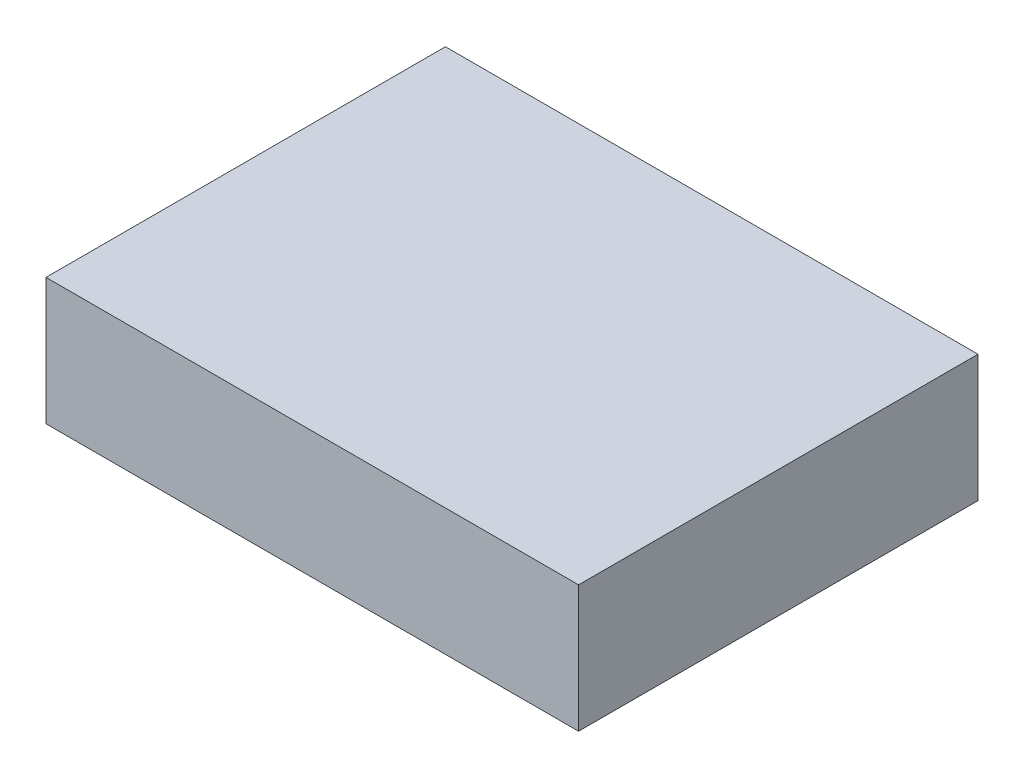
ISO-10303-21;
HEADER;
FILE_DESCRIPTION(('STEP AP214'),'2;1');
FILE_NAME('part.step','',(''),(''),'','','');
FILE_SCHEMA(('AUTOMOTIVE_DESIGN { 1 0 10303 214 1 1 1 1 }'));
ENDSEC;
DATA;
#1=APPLICATION_CONTEXT('core data for automotive mechanical design processes');
#2=APPLICATION_PROTOCOL_DEFINITION('international standard','automotive_design',2000,#1);
#3=PRODUCT_CONTEXT('',#1,'mechanical');
#4=PRODUCT('Part','Part','',(#3));
#5=PRODUCT_RELATED_PRODUCT_CATEGORY('part','',(#4));
#6=PRODUCT_DEFINITION_FORMATION('','',#4);
#7=PRODUCT_DEFINITION_CONTEXT('part definition',#1,'design');
#8=PRODUCT_DEFINITION('design','',#6,#7);
#9=PRODUCT_DEFINITION_SHAPE('','',#8);
#10=(LENGTH_UNIT() NAMED_UNIT(*) SI_UNIT(.MILLI.,.METRE.));
#11=(NAMED_UNIT(*) PLANE_ANGLE_UNIT() SI_UNIT($,.RADIAN.));
#12=(NAMED_UNIT(*) SI_UNIT($,.STERADIAN.) SOLID_ANGLE_UNIT());
#13=UNCERTAINTY_MEASURE_WITH_UNIT(LENGTH_MEASURE(1.E-05),#10,'distance_accuracy_value','');
#14=(GEOMETRIC_REPRESENTATION_CONTEXT(3) GLOBAL_UNCERTAINTY_ASSIGNED_CONTEXT((#13)) GLOBAL_UNIT_ASSIGNED_CONTEXT((#10,
#11,#12)) REPRESENTATION_CONTEXT('',''));
#15=CARTESIAN_POINT('',(0.,0.,0.));
#16=DIRECTION('',(0.,0.,1.));
#17=DIRECTION('',(1.,0.,0.));
#18=AXIS2_PLACEMENT_3D('',#15,#16,#17);
#19=CARTESIAN_POINT('',(0.,10.,0.));
#20=DIRECTION('',(0.,1.,0.));
#21=DIRECTION('',(0.,0.,1.));
#22=AXIS2_PLACEMENT_3D('',#19,#20,#21);
#23=PLANE('',#22);
#24=CARTESIAN_POINT('',(168.20925566672,10.,-172.938422578134));
#25=DIRECTION('',(0.,1.,0.));
#26=DIRECTION('',(0.,0.,1.));
#27=AXIS2_PLACEMENT_3D('',#24,#25,#26);
#28=CIRCLE('',#27,3.95154024550823);
#29=CARTESIAN_POINT('',(168.20925566672,10.,-168.986882332626));
#30=VERTEX_POINT('',#29);
#31=EDGE_CURVE('E252',#30,#30,#28,.T.);
#32=ORIENTED_EDGE('',*,*,#31,.F.);
#33=EDGE_LOOP('',(#32));
#34=FACE_BOUND('',#33,.T.);
#35=DIRECTION('',(-1.,0.,0.));
#36=VECTOR('',#35,1.);
#37=CARTESIAN_POINT('',(0.,10.,-157.5));
#38=LINE('',#37,#36);
#39=CARTESIAN_POINT('',(181.491132728051,10.,-157.5));
#40=VERTEX_POINT('',#39);
#41=CARTESIAN_POINT('',(156.491132728051,10.,-157.5));
#42=VERTEX_POINT('',#41);
#43=EDGE_CURVE('E11',#40,#42,#38,.T.);
#44=ORIENTED_EDGE('',*,*,#43,.F.);
#45=DIRECTION('',(0.,0.,-1.));
#46=VECTOR('',#45,1.);
#47=CARTESIAN_POINT('',(181.491132728051,10.,0.));
#48=LINE('',#47,#46);
#49=CARTESIAN_POINT('',(181.491132728051,10.,-172.5));
#50=VERTEX_POINT('',#49);
#51=EDGE_CURVE('E126',#40,#50,#48,.T.);
#52=ORIENTED_EDGE('',*,*,#51,.T.);
#53=CARTESIAN_POINT('',(171.491132728051,10.,-172.5));
#54=DIRECTION('',(0.,1.,0.));
#55=DIRECTION('',(0.,0.,1.));
#56=AXIS2_PLACEMENT_3D('',#53,#54,#55);
#57=CIRCLE('',#56,10.);
#58=CARTESIAN_POINT('',(171.49113272805,10.,-182.5));
#59=VERTEX_POINT('',#58);
#60=EDGE_CURVE('E270',#59,#50,#57,.F.);
#61=ORIENTED_EDGE('',*,*,#60,.F.);
#62=DIRECTION('',(1.,0.,0.));
#63=VECTOR('',#62,1.);
#64=CARTESIAN_POINT('',(0.,10.,-182.5));
#65=LINE('',#64,#63);
#66=CARTESIAN_POINT('',(166.491132728051,10.,-182.5));
#67=VERTEX_POINT('',#66);
#68=EDGE_CURVE('E273',#67,#59,#65,.T.);
#69=ORIENTED_EDGE('',*,*,#68,.F.);
#70=CARTESIAN_POINT('',(166.491132728051,10.,-172.5));
#71=DIRECTION('',(0.,1.,0.));
#72=DIRECTION('',(0.,0.,1.));
#73=AXIS2_PLACEMENT_3D('',#70,#71,#72);
#74=CIRCLE('',#73,10.);
#75=CARTESIAN_POINT('',(156.491132728051,10.,-172.5));
#76=VERTEX_POINT('',#75);
#77=EDGE_CURVE('E276',#76,#67,#74,.F.);
#78=ORIENTED_EDGE('',*,*,#77,.F.);
#79=DIRECTION('',(0.,0.,-1.));
#80=VECTOR('',#79,1.);
#81=CARTESIAN_POINT('',(156.491132728051,10.,0.));
#82=LINE('',#81,#80);
#83=EDGE_CURVE('E279',#42,#76,#82,.T.);
#84=ORIENTED_EDGE('',*,*,#83,.F.);
#85=EDGE_LOOP('',(#44,#52,#61,#69,#78,#84));
#86=FACE_BOUND('',#85,.T.);
#87=ADVANCED_FACE('F37',(#34,#86),#23,.T.);
#88=CARTESIAN_POINT('',(0.,10.,0.));
#89=DIRECTION('',(0.,0.,-1.));
#90=DIRECTION('',(-1.,0.,0.));
#91=AXIS2_PLACEMENT_3D('',#88,#89,#90);
#92=PLANE('',#91);
#93=DIRECTION('',(1.,0.,0.));
#94=VECTOR('',#93,1.);
#95=CARTESIAN_POINT('',(0.,0.,0.));
#96=LINE('',#95,#94);
#97=CARTESIAN_POINT('',(0.,0.,0.));
#98=VERTEX_POINT('',#97);
#99=CARTESIAN_POINT('',(210.,0.,0.));
#100=VERTEX_POINT('',#99);
#101=EDGE_CURVE('E177',#98,#100,#96,.T.);
#102=ORIENTED_EDGE('',*,*,#101,.T.);
#103=DIRECTION('',(0.,-1.,0.));
#104=VECTOR('',#103,1.);
#105=CARTESIAN_POINT('',(210.,10.,0.));
#106=LINE('',#105,#104);
#107=CARTESIAN_POINT('',(210.,50.,0.));
#108=VERTEX_POINT('',#107);
#109=EDGE_CURVE('E242',#108,#100,#106,.T.);
#110=ORIENTED_EDGE('',*,*,#109,.F.);
#111=DIRECTION('',(1.,0.,0.));
#112=VECTOR('',#111,1.);
#113=CARTESIAN_POINT('',(0.,50.,0.));
#114=LINE('',#113,#112);
#115=CARTESIAN_POINT('',(0.,50.,0.));
#116=VERTEX_POINT('',#115);
#117=EDGE_CURVE('E261',#116,#108,#114,.T.);
#118=ORIENTED_EDGE('',*,*,#117,.F.);
#119=DIRECTION('',(0.,-1.,0.));
#120=VECTOR('',#119,1.);
#121=CARTESIAN_POINT('',(0.,10.,0.));
#122=LINE('',#121,#120);
#123=EDGE_CURVE('E117',#116,#98,#122,.T.);
#124=ORIENTED_EDGE('',*,*,#123,.T.);
#125=EDGE_LOOP('',(#102,#110,#118,#124));
#126=FACE_BOUND('',#125,.T.);
#127=ADVANCED_FACE('F39',(#126),#92,.F.);
#128=CARTESIAN_POINT('',(210.,10.,0.));
#129=DIRECTION('',(-1.,0.,0.));
#130=DIRECTION('',(0.,0.,1.));
#131=AXIS2_PLACEMENT_3D('',#128,#129,#130);
#132=PLANE('',#131);
#133=DIRECTION('',(0.,0.,-1.));
#134=VECTOR('',#133,1.);
#135=CARTESIAN_POINT('',(210.,0.,0.));
#136=LINE('',#135,#134);
#137=CARTESIAN_POINT('',(210.,0.,-157.5));
#138=VERTEX_POINT('',#137);
#139=EDGE_CURVE('E179',#100,#138,#136,.T.);
#140=ORIENTED_EDGE('',*,*,#139,.T.);
#141=DIRECTION('',(0.,-1.,0.));
#142=VECTOR('',#141,1.);
#143=CARTESIAN_POINT('',(210.,10.,-157.5));
#144=LINE('',#143,#142);
#145=CARTESIAN_POINT('',(210.,50.,-157.5));
#146=VERTEX_POINT('',#145);
#147=EDGE_CURVE('E240',#146,#138,#144,.T.);
#148=ORIENTED_EDGE('',*,*,#147,.F.);
#149=DIRECTION('',(0.,0.,-1.));
#150=VECTOR('',#149,1.);
#151=CARTESIAN_POINT('',(210.,50.,-157.5));
#152=LINE('',#151,#150);
#153=EDGE_CURVE('E264',#108,#146,#152,.T.);
#154=ORIENTED_EDGE('',*,*,#153,.F.);
#155=ORIENTED_EDGE('',*,*,#109,.T.);
#156=EDGE_LOOP('',(#140,#148,#154,#155));
#157=FACE_BOUND('',#156,.T.);
#158=ADVANCED_FACE('F340',(#157),#132,.F.);
#159=CARTESIAN_POINT('',(181.491132728051,10.,0.));
#160=DIRECTION('',(-1.,0.,0.));
#161=DIRECTION('',(0.,0.,1.));
#162=AXIS2_PLACEMENT_3D('',#159,#160,#161);
#163=PLANE('',#162);
#164=DIRECTION('',(0.,0.,-1.));
#165=VECTOR('',#164,1.);
#166=CARTESIAN_POINT('',(181.491132728051,0.,0.));
#167=LINE('',#166,#165);
#168=CARTESIAN_POINT('',(181.491132728051,0.,-157.5));
#169=VERTEX_POINT('',#168);
#170=CARTESIAN_POINT('',(181.491132728051,0.,-172.5));
#171=VERTEX_POINT('',#170);
#172=EDGE_CURVE('E186',#169,#171,#167,.T.);
#173=ORIENTED_EDGE('',*,*,#172,.T.);
#174=DIRECTION('',(0.,-1.,0.));
#175=VECTOR('',#174,1.);
#176=CARTESIAN_POINT('',(181.491132728051,10.,-172.5));
#177=LINE('',#176,#175);
#178=EDGE_CURVE('E236',#50,#171,#177,.T.);
#179=ORIENTED_EDGE('',*,*,#178,.F.);
#180=ORIENTED_EDGE('',*,*,#51,.F.);
#181=DIRECTION('',(0.,-1.,0.));
#182=VECTOR('',#181,1.);
#183=CARTESIAN_POINT('',(181.491132728051,10.,-157.5));
#184=LINE('',#183,#182);
#185=EDGE_CURVE('E238',#40,#169,#184,.T.);
#186=ORIENTED_EDGE('',*,*,#185,.T.);
#187=EDGE_LOOP('',(#173,#179,#180,#186));
#188=FACE_BOUND('',#187,.T.);
#189=ADVANCED_FACE('F320',(#188),#163,.F.);
#190=CARTESIAN_POINT('',(171.491132728051,10.,-172.5));
#191=DIRECTION('',(0.,-1.,0.));
#192=DIRECTION('',(0.,0.,-1.));
#193=AXIS2_PLACEMENT_3D('',#190,#191,#192);
#194=CYLINDRICAL_SURFACE('',#193,10.);
#195=CARTESIAN_POINT('',(171.491132728051,0.,-172.5));
#196=DIRECTION('',(0.,1.,0.));
#197=DIRECTION('',(0.,0.,1.));
#198=AXIS2_PLACEMENT_3D('',#195,#196,#197);
#199=CIRCLE('',#198,10.);
#200=CARTESIAN_POINT('',(171.49113272805,0.,-182.5));
#201=VERTEX_POINT('',#200);
#202=EDGE_CURVE('E191',#201,#171,#199,.F.);
#203=ORIENTED_EDGE('',*,*,#202,.F.);
#204=DIRECTION('',(0.,-1.,0.));
#205=VECTOR('',#204,1.);
#206=CARTESIAN_POINT('',(171.49113272805,10.,-182.5));
#207=LINE('',#206,#205);
#208=EDGE_CURVE('E234',#59,#201,#207,.T.);
#209=ORIENTED_EDGE('',*,*,#208,.F.);
#210=ORIENTED_EDGE('',*,*,#60,.T.);
#211=ORIENTED_EDGE('',*,*,#178,.T.);
#212=EDGE_LOOP('',(#203,#209,#210,#211));
#213=FACE_BOUND('',#212,.T.);
#214=ADVANCED_FACE('F318',(#213),#194,.T.);
#215=CARTESIAN_POINT('',(0.,10.,-182.5));
#216=DIRECTION('',(0.,0.,-1.));
#217=DIRECTION('',(-1.,0.,0.));
#218=AXIS2_PLACEMENT_3D('',#215,#216,#217);
#219=PLANE('',#218);
#220=DIRECTION('',(1.,0.,0.));
#221=VECTOR('',#220,1.);
#222=CARTESIAN_POINT('',(0.,0.,-182.5));
#223=LINE('',#222,#221);
#224=CARTESIAN_POINT('',(166.491132728051,0.,-182.5));
#225=VERTEX_POINT('',#224);
#226=EDGE_CURVE('E194',#225,#201,#223,.T.);
#227=ORIENTED_EDGE('',*,*,#226,.F.);
#228=DIRECTION('',(0.,-1.,0.));
#229=VECTOR('',#228,1.);
#230=CARTESIAN_POINT('',(166.491132728051,10.,-182.5));
#231=LINE('',#230,#229);
#232=EDGE_CURVE('E232',#67,#225,#231,.T.);
#233=ORIENTED_EDGE('',*,*,#232,.F.);
#234=ORIENTED_EDGE('',*,*,#68,.T.);
#235=ORIENTED_EDGE('',*,*,#208,.T.);
#236=EDGE_LOOP('',(#227,#233,#234,#235));
#237=FACE_BOUND('',#236,.T.);
#238=ADVANCED_FACE('F313',(#237),#219,.T.);
#239=CARTESIAN_POINT('',(166.491132728051,10.,-172.5));
#240=DIRECTION('',(0.,-1.,0.));
#241=DIRECTION('',(0.,0.,-1.));
#242=AXIS2_PLACEMENT_3D('',#239,#240,#241);
#243=CYLINDRICAL_SURFACE('',#242,10.);
#244=CARTESIAN_POINT('',(166.491132728051,0.,-172.5));
#245=DIRECTION('',(0.,1.,0.));
#246=DIRECTION('',(0.,0.,1.));
#247=AXIS2_PLACEMENT_3D('',#244,#245,#246);
#248=CIRCLE('',#247,10.);
#249=CARTESIAN_POINT('',(156.491132728051,0.,-172.5));
#250=VERTEX_POINT('',#249);
#251=EDGE_CURVE('E197',#250,#225,#248,.F.);
#252=ORIENTED_EDGE('',*,*,#251,.F.);
#253=DIRECTION('',(0.,-1.,0.));
#254=VECTOR('',#253,1.);
#255=CARTESIAN_POINT('',(156.491132728051,10.,-172.5));
#256=LINE('',#255,#254);
#257=EDGE_CURVE('E230',#76,#250,#256,.T.);
#258=ORIENTED_EDGE('',*,*,#257,.F.);
#259=ORIENTED_EDGE('',*,*,#77,.T.);
#260=ORIENTED_EDGE('',*,*,#232,.T.);
#261=EDGE_LOOP('',(#252,#258,#259,#260));
#262=FACE_BOUND('',#261,.T.);
#263=ADVANCED_FACE('F309',(#262),#243,.T.);
#264=CARTESIAN_POINT('',(156.491132728051,10.,0.));
#265=DIRECTION('',(-1.,0.,0.));
#266=DIRECTION('',(0.,0.,1.));
#267=AXIS2_PLACEMENT_3D('',#264,#265,#266);
#268=PLANE('',#267);
#269=DIRECTION('',(0.,0.,-1.));
#270=VECTOR('',#269,1.);
#271=CARTESIAN_POINT('',(156.491132728051,0.,0.));
#272=LINE('',#271,#270);
#273=CARTESIAN_POINT('',(156.491132728051,0.,-157.5));
#274=VERTEX_POINT('',#273);
#275=EDGE_CURVE('E200',#274,#250,#272,.T.);
#276=ORIENTED_EDGE('',*,*,#275,.F.);
#277=DIRECTION('',(0.,-1.,0.));
#278=VECTOR('',#277,1.);
#279=CARTESIAN_POINT('',(156.491132728051,10.,-157.5));
#280=LINE('',#279,#278);
#281=EDGE_CURVE('E228',#42,#274,#280,.T.);
#282=ORIENTED_EDGE('',*,*,#281,.F.);
#283=ORIENTED_EDGE('',*,*,#83,.T.);
#284=ORIENTED_EDGE('',*,*,#257,.T.);
#285=EDGE_LOOP('',(#276,#282,#283,#284));
#286=FACE_BOUND('',#285,.T.);
#287=ADVANCED_FACE('F305',(#286),#268,.T.);
#288=CARTESIAN_POINT('',(59.0564947481196,10.,0.));
#289=DIRECTION('',(-1.,0.,0.));
#290=DIRECTION('',(0.,0.,1.));
#291=AXIS2_PLACEMENT_3D('',#288,#289,#290);
#292=PLANE('',#291);
#293=DIRECTION('',(0.,0.,-1.));
#294=VECTOR('',#293,1.);
#295=CARTESIAN_POINT('',(59.0564947481196,0.,0.));
#296=LINE('',#295,#294);
#297=CARTESIAN_POINT('',(59.0564947481196,0.,-157.5));
#298=VERTEX_POINT('',#297);
#299=CARTESIAN_POINT('',(59.0564947481196,0.,-172.5));
#300=VERTEX_POINT('',#299);
#301=EDGE_CURVE('E203',#298,#300,#296,.T.);
#302=ORIENTED_EDGE('',*,*,#301,.T.);
#303=DIRECTION('',(0.,-1.,0.));
#304=VECTOR('',#303,1.);
#305=CARTESIAN_POINT('',(59.0564947481196,10.,-172.5));
#306=LINE('',#305,#304);
#307=CARTESIAN_POINT('',(59.0564947481196,10.,-172.5));
#308=VERTEX_POINT('',#307);
#309=EDGE_CURVE('E224',#308,#300,#306,.T.);
#310=ORIENTED_EDGE('',*,*,#309,.F.);
#311=DIRECTION('',(0.,0.,-1.));
#312=VECTOR('',#311,1.);
#313=CARTESIAN_POINT('',(59.0564947481196,10.,0.));
#314=LINE('',#313,#312);
#315=CARTESIAN_POINT('',(59.0564947481196,10.,-157.5));
#316=VERTEX_POINT('',#315);
#317=EDGE_CURVE('E282',#316,#308,#314,.T.);
#318=ORIENTED_EDGE('',*,*,#317,.F.);
#319=DIRECTION('',(0.,-1.,0.));
#320=VECTOR('',#319,1.);
#321=CARTESIAN_POINT('',(59.0564947481196,10.,-157.5));
#322=LINE('',#321,#320);
#323=EDGE_CURVE('E226',#316,#298,#322,.T.);
#324=ORIENTED_EDGE('',*,*,#323,.T.);
#325=EDGE_LOOP('',(#302,#310,#318,#324));
#326=FACE_BOUND('',#325,.T.);
#327=ADVANCED_FACE('F300',(#326),#292,.F.);
#328=CARTESIAN_POINT('',(49.0564947481196,10.,-172.5));
#329=DIRECTION('',(0.,-1.,0.));
#330=DIRECTION('',(0.,0.,-1.));
#331=AXIS2_PLACEMENT_3D('',#328,#329,#330);
#332=CYLINDRICAL_SURFACE('',#331,10.);
#333=CARTESIAN_POINT('',(49.0564947481196,0.,-172.5));
#334=DIRECTION('',(0.,1.,0.));
#335=DIRECTION('',(0.,0.,1.));
#336=AXIS2_PLACEMENT_3D('',#333,#334,#335);
#337=CIRCLE('',#336,10.);
#338=CARTESIAN_POINT('',(49.0564947481195,0.,-182.5));
#339=VERTEX_POINT('',#338);
#340=EDGE_CURVE('E206',#339,#300,#337,.F.);
#341=ORIENTED_EDGE('',*,*,#340,.F.);
#342=DIRECTION('',(0.,-1.,0.));
#343=VECTOR('',#342,1.);
#344=CARTESIAN_POINT('',(49.0564947481195,10.,-182.5));
#345=LINE('',#344,#343);
#346=CARTESIAN_POINT('',(49.0564947481195,10.,-182.5));
#347=VERTEX_POINT('',#346);
#348=EDGE_CURVE('E158',#347,#339,#345,.T.);
#349=ORIENTED_EDGE('',*,*,#348,.F.);
#350=CARTESIAN_POINT('',(49.0564947481196,10.,-172.5));
#351=DIRECTION('',(0.,1.,0.));
#352=DIRECTION('',(0.,0.,1.));
#353=AXIS2_PLACEMENT_3D('',#350,#351,#352);
#354=CIRCLE('',#353,10.);
#355=EDGE_CURVE('E169',#347,#308,#354,.F.);
#356=ORIENTED_EDGE('',*,*,#355,.T.);
#357=ORIENTED_EDGE('',*,*,#309,.T.);
#358=EDGE_LOOP('',(#341,#349,#356,#357));
#359=FACE_BOUND('',#358,.T.);
#360=ADVANCED_FACE('F285',(#359),#332,.T.);
#361=CARTESIAN_POINT('',(0.,10.,-182.5));
#362=DIRECTION('',(0.,0.,-1.));
#363=DIRECTION('',(-1.,0.,0.));
#364=AXIS2_PLACEMENT_3D('',#361,#362,#363);
#365=PLANE('',#364);
#366=DIRECTION('',(1.,0.,0.));
#367=VECTOR('',#366,1.);
#368=CARTESIAN_POINT('',(0.,0.,-182.5));
#369=LINE('',#368,#367);
#370=CARTESIAN_POINT('',(44.0564947481197,0.,-182.5));
#371=VERTEX_POINT('',#370);
#372=EDGE_CURVE('E153',#371,#339,#369,.T.);
#373=ORIENTED_EDGE('',*,*,#372,.F.);
#374=DIRECTION('',(0.,-1.,0.));
#375=VECTOR('',#374,1.);
#376=CARTESIAN_POINT('',(44.0564947481197,10.,-182.5));
#377=LINE('',#376,#375);
#378=CARTESIAN_POINT('',(44.0564947481197,10.,-182.5));
#379=VERTEX_POINT('',#378);
#380=EDGE_CURVE('E148',#379,#371,#377,.T.);
#381=ORIENTED_EDGE('',*,*,#380,.F.);
#382=DIRECTION('',(1.,0.,0.));
#383=VECTOR('',#382,1.);
#384=CARTESIAN_POINT('',(0.,10.,-182.5));
#385=LINE('',#384,#383);
#386=EDGE_CURVE('E151',#379,#347,#385,.T.);
#387=ORIENTED_EDGE('',*,*,#386,.T.);
#388=ORIENTED_EDGE('',*,*,#348,.T.);
#389=EDGE_LOOP('',(#373,#381,#387,#388));
#390=FACE_BOUND('',#389,.T.);
#391=ADVANCED_FACE('F150',(#390),#365,.T.);
#392=CARTESIAN_POINT('',(44.0564947481196,10.,-172.5));
#393=DIRECTION('',(0.,-1.,0.));
#394=DIRECTION('',(0.,0.,-1.));
#395=AXIS2_PLACEMENT_3D('',#392,#393,#394);
#396=CYLINDRICAL_SURFACE('',#395,10.);
#397=CARTESIAN_POINT('',(44.0564947481196,0.,-172.5));
#398=DIRECTION('',(0.,1.,0.));
#399=DIRECTION('',(0.,0.,1.));
#400=AXIS2_PLACEMENT_3D('',#397,#398,#399);
#401=CIRCLE('',#400,10.);
#402=CARTESIAN_POINT('',(34.0564947481196,0.,-172.5));
#403=VERTEX_POINT('',#402);
#404=EDGE_CURVE('E210',#403,#371,#401,.F.);
#405=ORIENTED_EDGE('',*,*,#404,.F.);
#406=DIRECTION('',(0.,-1.,0.));
#407=VECTOR('',#406,1.);
#408=CARTESIAN_POINT('',(34.0564947481196,10.,-172.5));
#409=LINE('',#408,#407);
#410=CARTESIAN_POINT('',(34.0564947481196,10.,-172.5));
#411=VERTEX_POINT('',#410);
#412=EDGE_CURVE('E159',#411,#403,#409,.T.);
#413=ORIENTED_EDGE('',*,*,#412,.F.);
#414=CARTESIAN_POINT('',(44.0564947481196,10.,-172.5));
#415=DIRECTION('',(0.,1.,0.));
#416=DIRECTION('',(0.,0.,1.));
#417=AXIS2_PLACEMENT_3D('',#414,#415,#416);
#418=CIRCLE('',#417,10.);
#419=EDGE_CURVE('E166',#411,#379,#418,.F.);
#420=ORIENTED_EDGE('',*,*,#419,.T.);
#421=ORIENTED_EDGE('',*,*,#380,.T.);
#422=EDGE_LOOP('',(#405,#413,#420,#421));
#423=FACE_BOUND('',#422,.T.);
#424=ADVANCED_FACE('F171',(#423),#396,.T.);
#425=CARTESIAN_POINT('',(34.0564947481196,10.,0.));
#426=DIRECTION('',(-1.,0.,0.));
#427=DIRECTION('',(0.,0.,1.));
#428=AXIS2_PLACEMENT_3D('',#425,#426,#427);
#429=PLANE('',#428);
#430=DIRECTION('',(0.,0.,-1.));
#431=VECTOR('',#430,1.);
#432=CARTESIAN_POINT('',(34.0564947481196,0.,0.));
#433=LINE('',#432,#431);
#434=CARTESIAN_POINT('',(34.0564947481196,0.,-157.5));
#435=VERTEX_POINT('',#434);
#436=EDGE_CURVE('E212',#435,#403,#433,.T.);
#437=ORIENTED_EDGE('',*,*,#436,.F.);
#438=DIRECTION('',(0.,-1.,0.));
#439=VECTOR('',#438,1.);
#440=CARTESIAN_POINT('',(34.0564947481196,10.,-157.5));
#441=LINE('',#440,#439);
#442=CARTESIAN_POINT('',(34.0564947481196,10.,-157.5));
#443=VERTEX_POINT('',#442);
#444=EDGE_CURVE('E220',#443,#435,#441,.T.);
#445=ORIENTED_EDGE('',*,*,#444,.F.);
#446=DIRECTION('',(0.,0.,-1.));
#447=VECTOR('',#446,1.);
#448=CARTESIAN_POINT('',(34.0564947481196,10.,0.));
#449=LINE('',#448,#447);
#450=EDGE_CURVE('E172',#443,#411,#449,.T.);
#451=ORIENTED_EDGE('',*,*,#450,.T.);
#452=ORIENTED_EDGE('',*,*,#412,.T.);
#453=EDGE_LOOP('',(#437,#445,#451,#452));
#454=FACE_BOUND('',#453,.T.);
#455=ADVANCED_FACE('F293',(#454),#429,.T.);
#456=CARTESIAN_POINT('',(0.,10.,-157.5));
#457=DIRECTION('',(0.,0.,-1.));
#458=DIRECTION('',(-1.,0.,0.));
#459=AXIS2_PLACEMENT_3D('',#456,#457,#458);
#460=PLANE('',#459);
#461=DIRECTION('',(1.,0.,0.));
#462=VECTOR('',#461,1.);
#463=CARTESIAN_POINT('',(0.,0.,-157.5));
#464=LINE('',#463,#462);
#465=CARTESIAN_POINT('',(0.,0.,-157.5));
#466=VERTEX_POINT('',#465);
#467=EDGE_CURVE('E187',#466,#435,#464,.T.);
#468=ORIENTED_EDGE('',*,*,#467,.F.);
#469=DIRECTION('',(0.,-1.,0.));
#470=VECTOR('',#469,1.);
#471=CARTESIAN_POINT('',(0.,10.,-157.5));
#472=LINE('',#471,#470);
#473=CARTESIAN_POINT('',(0.,50.,-157.5));
#474=VERTEX_POINT('',#473);
#475=EDGE_CURVE('E109',#474,#466,#472,.T.);
#476=ORIENTED_EDGE('',*,*,#475,.F.);
#477=DIRECTION('',(-1.,0.,0.));
#478=VECTOR('',#477,1.);
#479=CARTESIAN_POINT('',(0.,50.,-157.5));
#480=LINE('',#479,#478);
#481=EDGE_CURVE('E180',#146,#474,#480,.T.);
#482=ORIENTED_EDGE('',*,*,#481,.F.);
#483=ORIENTED_EDGE('',*,*,#147,.T.);
#484=EDGE_CURVE('E183',#169,#138,#464,.T.);
#485=ORIENTED_EDGE('',*,*,#484,.F.);
#486=ORIENTED_EDGE('',*,*,#185,.F.);
#487=ORIENTED_EDGE('',*,*,#43,.T.);
#488=ORIENTED_EDGE('',*,*,#281,.T.);
#489=EDGE_CURVE('E188',#298,#274,#464,.T.);
#490=ORIENTED_EDGE('',*,*,#489,.F.);
#491=ORIENTED_EDGE('',*,*,#323,.F.);
#492=EDGE_CURVE('E47',#316,#443,#38,.T.);
#493=ORIENTED_EDGE('',*,*,#492,.T.);
#494=ORIENTED_EDGE('',*,*,#444,.T.);
#495=EDGE_LOOP('',(#468,#476,#482,#483,#485,#486,#487,#488,#490,#491,#493,#494));
#496=FACE_BOUND('',#495,.T.);
#497=ADVANCED_FACE('F297',(#496),#460,.T.);
#498=CARTESIAN_POINT('',(0.,10.,0.));
#499=DIRECTION('',(-1.,0.,0.));
#500=DIRECTION('',(0.,0.,1.));
#501=AXIS2_PLACEMENT_3D('',#498,#499,#500);
#502=PLANE('',#501);
#503=DIRECTION('',(0.,0.,-1.));
#504=VECTOR('',#503,1.);
#505=CARTESIAN_POINT('',(0.,0.,0.));
#506=LINE('',#505,#504);
#507=EDGE_CURVE('E215',#98,#466,#506,.T.);
#508=ORIENTED_EDGE('',*,*,#507,.F.);
#509=ORIENTED_EDGE('',*,*,#123,.F.);
#510=DIRECTION('',(0.,0.,1.));
#511=VECTOR('',#510,1.);
#512=CARTESIAN_POINT('',(0.,50.,-157.5));
#513=LINE('',#512,#511);
#514=EDGE_CURVE('E250',#474,#116,#513,.T.);
#515=ORIENTED_EDGE('',*,*,#514,.F.);
#516=ORIENTED_EDGE('',*,*,#475,.T.);
#517=EDGE_LOOP('',(#508,#509,#515,#516));
#518=FACE_BOUND('',#517,.T.);
#519=ADVANCED_FACE('F334',(#518),#502,.T.);
#520=CARTESIAN_POINT('',(46.4811837997152,10.,-172.938422578134));
#521=DIRECTION('',(0.,1.,0.));
#522=DIRECTION('',(0.,0.,1.));
#523=AXIS2_PLACEMENT_3D('',#520,#521,#522);
#524=CIRCLE('',#523,3.79044748966997);
#525=CARTESIAN_POINT('',(46.4811837997152,10.,-169.147975088465));
#526=VERTEX_POINT('',#525);
#527=EDGE_CURVE('E246',#526,#526,#524,.T.);
#528=ORIENTED_EDGE('',*,*,#527,.F.);
#529=EDGE_LOOP('',(#528));
#530=FACE_BOUND('',#529,.T.);
#531=ORIENTED_EDGE('',*,*,#492,.F.);
#532=ORIENTED_EDGE('',*,*,#317,.T.);
#533=ORIENTED_EDGE('',*,*,#355,.F.);
#534=ORIENTED_EDGE('',*,*,#386,.F.);
#535=ORIENTED_EDGE('',*,*,#419,.F.);
#536=ORIENTED_EDGE('',*,*,#450,.F.);
#537=EDGE_LOOP('',(#531,#532,#533,#534,#535,#536));
#538=FACE_BOUND('',#537,.T.);
#539=ADVANCED_FACE('F164',(#530,#538),#23,.T.);
#540=CARTESIAN_POINT('',(0.,0.,0.));
#541=DIRECTION('',(0.,1.,0.));
#542=DIRECTION('',(0.,0.,1.));
#543=AXIS2_PLACEMENT_3D('',#540,#541,#542);
#544=PLANE('',#543);
#545=CARTESIAN_POINT('',(46.4811837997152,0.,-172.938422578134));
#546=DIRECTION('',(0.,1.,0.));
#547=DIRECTION('',(0.,0.,1.));
#548=AXIS2_PLACEMENT_3D('',#545,#546,#547);
#549=CIRCLE('',#548,3.79044748966997);
#550=CARTESIAN_POINT('',(46.4811837997152,0.,-169.147975088465));
#551=VERTEX_POINT('',#550);
#552=EDGE_CURVE('E41',#551,#551,#549,.T.);
#553=ORIENTED_EDGE('',*,*,#552,.T.);
#554=EDGE_LOOP('',(#553));
#555=FACE_BOUND('',#554,.T.);
#556=CARTESIAN_POINT('',(168.20925566672,0.,-172.938422578134));
#557=DIRECTION('',(0.,1.,0.));
#558=DIRECTION('',(0.,0.,1.));
#559=AXIS2_PLACEMENT_3D('',#556,#557,#558);
#560=CIRCLE('',#559,3.95154024550823);
#561=CARTESIAN_POINT('',(168.20925566672,0.,-168.986882332626));
#562=VERTEX_POINT('',#561);
#563=EDGE_CURVE('E244',#562,#562,#560,.T.);
#564=ORIENTED_EDGE('',*,*,#563,.T.);
#565=EDGE_LOOP('',(#564));
#566=FACE_BOUND('',#565,.T.);
#567=ORIENTED_EDGE('',*,*,#101,.F.);
#568=ORIENTED_EDGE('',*,*,#507,.T.);
#569=ORIENTED_EDGE('',*,*,#467,.T.);
#570=ORIENTED_EDGE('',*,*,#436,.T.);
#571=ORIENTED_EDGE('',*,*,#404,.T.);
#572=ORIENTED_EDGE('',*,*,#372,.T.);
#573=ORIENTED_EDGE('',*,*,#340,.T.);
#574=ORIENTED_EDGE('',*,*,#301,.F.);
#575=ORIENTED_EDGE('',*,*,#489,.T.);
#576=ORIENTED_EDGE('',*,*,#275,.T.);
#577=ORIENTED_EDGE('',*,*,#251,.T.);
#578=ORIENTED_EDGE('',*,*,#226,.T.);
#579=ORIENTED_EDGE('',*,*,#202,.T.);
#580=ORIENTED_EDGE('',*,*,#172,.F.);
#581=ORIENTED_EDGE('',*,*,#484,.T.);
#582=ORIENTED_EDGE('',*,*,#139,.F.);
#583=EDGE_LOOP('',(#567,#568,#569,#570,#571,#572,#573,#574,#575,#576,#577,#578,#579,#580,#581,#582));
#584=FACE_BOUND('',#583,.T.);
#585=ADVANCED_FACE('F289',(#555,#566,#584),#544,.F.);
#586=CARTESIAN_POINT('',(0.,50.,0.));
#587=DIRECTION('',(0.,1.,0.));
#588=DIRECTION('',(0.,0.,1.));
#589=AXIS2_PLACEMENT_3D('',#586,#587,#588);
#590=PLANE('',#589);
#591=ORIENTED_EDGE('',*,*,#514,.T.);
#592=ORIENTED_EDGE('',*,*,#117,.T.);
#593=ORIENTED_EDGE('',*,*,#153,.T.);
#594=ORIENTED_EDGE('',*,*,#481,.T.);
#595=EDGE_LOOP('',(#591,#592,#593,#594));
#596=FACE_BOUND('',#595,.T.);
#597=ADVANCED_FACE('F337',(#596),#590,.T.);
#598=CARTESIAN_POINT('',(168.20925566672,-30.,-172.938422578134));
#599=DIRECTION('',(0.,1.,0.));
#600=DIRECTION('',(0.,0.,1.));
#601=AXIS2_PLACEMENT_3D('',#598,#599,#600);
#602=CYLINDRICAL_SURFACE('',#601,3.95154024550823);
#603=ORIENTED_EDGE('',*,*,#31,.T.);
#604=EDGE_LOOP('',(#603));
#605=FACE_BOUND('',#604,.T.);
#606=ORIENTED_EDGE('',*,*,#563,.F.);
#607=EDGE_LOOP('',(#606));
#608=FACE_BOUND('',#607,.T.);
#609=ADVANCED_FACE('F441',(#605,#608),#602,.F.);
#610=CARTESIAN_POINT('',(46.4811837997152,-30.,-172.938422578134));
#611=DIRECTION('',(0.,1.,0.));
#612=DIRECTION('',(0.,0.,1.));
#613=AXIS2_PLACEMENT_3D('',#610,#611,#612);
#614=CYLINDRICAL_SURFACE('',#613,3.79044748966997);
#615=ORIENTED_EDGE('',*,*,#527,.T.);
#616=EDGE_LOOP('',(#615));
#617=FACE_BOUND('',#616,.T.);
#618=ORIENTED_EDGE('',*,*,#552,.F.);
#619=EDGE_LOOP('',(#618));
#620=FACE_BOUND('',#619,.T.);
#621=ADVANCED_FACE('F470',(#617,#620),#614,.F.);
#622=CLOSED_SHELL('',(#87,#127,#158,#189,#214,#238,#263,#287,#327,#360,#391,#424,#455,#497,#519,
#539,#585,#597,#609,#621));
#623=MANIFOLD_SOLID_BREP('B2',#622);
#624=ADVANCED_BREP_SHAPE_REPRESENTATION('',(#18,#623),#14);
#625=SHAPE_DEFINITION_REPRESENTATION(#9,#624);
ENDSEC;
END-ISO-10303-21;
